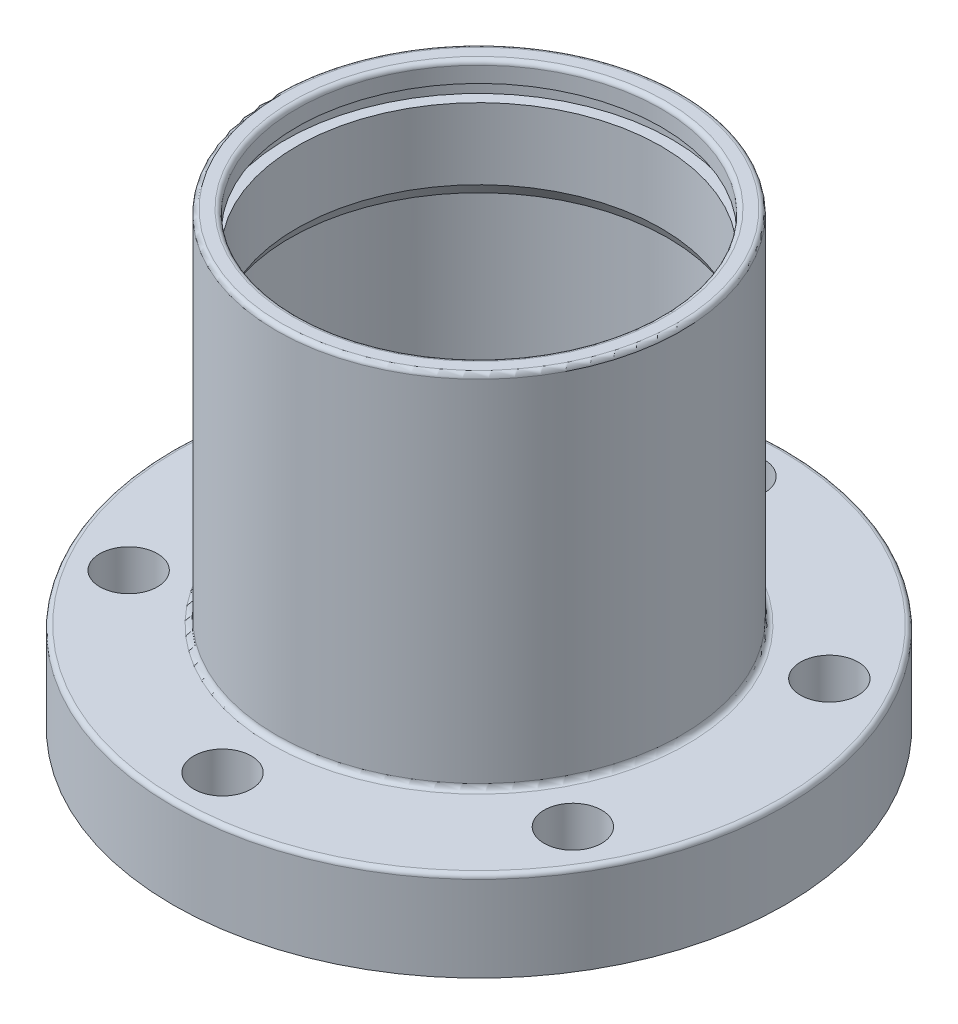
ISO-10303-21;
HEADER;
FILE_DESCRIPTION(('STEP AP214'),'2;1');
FILE_NAME('part.step','',(''),(''),'','','');
FILE_SCHEMA(('AUTOMOTIVE_DESIGN { 1 0 10303 214 1 1 1 1 }'));
ENDSEC;
DATA;
#1=APPLICATION_CONTEXT('core data for automotive mechanical design processes');
#2=APPLICATION_PROTOCOL_DEFINITION('international standard','automotive_design',2000,#1);
#3=PRODUCT_CONTEXT('',#1,'mechanical');
#4=PRODUCT('Part','Part','',(#3));
#5=PRODUCT_RELATED_PRODUCT_CATEGORY('part','',(#4));
#6=PRODUCT_DEFINITION_FORMATION('','',#4);
#7=PRODUCT_DEFINITION_CONTEXT('part definition',#1,'design');
#8=PRODUCT_DEFINITION('design','',#6,#7);
#9=PRODUCT_DEFINITION_SHAPE('','',#8);
#10=(LENGTH_UNIT() NAMED_UNIT(*) SI_UNIT(.MILLI.,.METRE.));
#11=(NAMED_UNIT(*) PLANE_ANGLE_UNIT() SI_UNIT($,.RADIAN.));
#12=(NAMED_UNIT(*) SI_UNIT($,.STERADIAN.) SOLID_ANGLE_UNIT());
#13=UNCERTAINTY_MEASURE_WITH_UNIT(LENGTH_MEASURE(1.E-05),#10,'distance_accuracy_value','');
#14=(GEOMETRIC_REPRESENTATION_CONTEXT(3) GLOBAL_UNCERTAINTY_ASSIGNED_CONTEXT((#13)) GLOBAL_UNIT_ASSIGNED_CONTEXT((#10,
#11,#12)) REPRESENTATION_CONTEXT('',''));
#15=CARTESIAN_POINT('',(0.,0.,0.));
#16=DIRECTION('',(0.,0.,1.));
#17=DIRECTION('',(1.,0.,0.));
#18=AXIS2_PLACEMENT_3D('',#15,#16,#17);
#19=CARTESIAN_POINT('',(17.,4.,0.));
#20=DIRECTION('',(0.,1.,0.));
#21=DIRECTION('',(0.,0.,1.));
#22=AXIS2_PLACEMENT_3D('',#19,#20,#21);
#23=CYLINDRICAL_SURFACE('',#22,2.075);
#24=CARTESIAN_POINT('',(17.,4.,0.));
#25=DIRECTION('',(0.,1.,0.));
#26=DIRECTION('',(0.,0.,1.));
#27=AXIS2_PLACEMENT_3D('',#24,#25,#26);
#28=CIRCLE('',#27,2.075);
#29=CARTESIAN_POINT('',(17.,4.,2.075));
#30=VERTEX_POINT('',#29);
#31=EDGE_CURVE('E252',#30,#30,#28,.T.);
#32=ORIENTED_EDGE('',*,*,#31,.F.);
#33=EDGE_LOOP('',(#32));
#34=FACE_BOUND('',#33,.T.);
#35=CARTESIAN_POINT('',(17.,9.,0.));
#36=DIRECTION('',(0.,1.,0.));
#37=DIRECTION('',(0.,0.,1.));
#38=AXIS2_PLACEMENT_3D('',#35,#36,#37);
#39=CIRCLE('',#38,2.075);
#40=CARTESIAN_POINT('',(17.,9.,2.075));
#41=VERTEX_POINT('',#40);
#42=EDGE_CURVE('E289',#41,#41,#39,.T.);
#43=ORIENTED_EDGE('',*,*,#42,.T.);
#44=EDGE_LOOP('',(#43));
#45=FACE_BOUND('',#44,.T.);
#46=ADVANCED_FACE('F16',(#34,#45),#23,.F.);
#47=CARTESIAN_POINT('',(-17.,4.,0.));
#48=DIRECTION('',(0.,1.,0.));
#49=DIRECTION('',(0.,0.,1.));
#50=AXIS2_PLACEMENT_3D('',#47,#48,#49);
#51=CYLINDRICAL_SURFACE('',#50,2.075);
#52=CARTESIAN_POINT('',(-17.,4.,0.));
#53=DIRECTION('',(0.,1.,0.));
#54=DIRECTION('',(0.,0.,1.));
#55=AXIS2_PLACEMENT_3D('',#52,#53,#54);
#56=CIRCLE('',#55,2.075);
#57=CARTESIAN_POINT('',(-17.,4.,2.075));
#58=VERTEX_POINT('',#57);
#59=EDGE_CURVE('E247',#58,#58,#56,.T.);
#60=ORIENTED_EDGE('',*,*,#59,.F.);
#61=EDGE_LOOP('',(#60));
#62=FACE_BOUND('',#61,.T.);
#63=CARTESIAN_POINT('',(-17.,9.,0.));
#64=DIRECTION('',(0.,1.,0.));
#65=DIRECTION('',(0.,0.,1.));
#66=AXIS2_PLACEMENT_3D('',#63,#64,#65);
#67=CIRCLE('',#66,2.075);
#68=CARTESIAN_POINT('',(-17.,9.,2.075));
#69=VERTEX_POINT('',#68);
#70=EDGE_CURVE('E284',#69,#69,#67,.T.);
#71=ORIENTED_EDGE('',*,*,#70,.T.);
#72=EDGE_LOOP('',(#71));
#73=FACE_BOUND('',#72,.T.);
#74=ADVANCED_FACE('F320',(#62,#73),#51,.F.);
#75=CARTESIAN_POINT('',(-24.6817240078565,7.5,14.25));
#76=DIRECTION('',(0.,1.,0.));
#77=DIRECTION('',(-0.866025403784439,0.,0.5));
#78=AXIS2_PLACEMENT_3D('',#75,#76,#77);
#79=CYLINDRICAL_SURFACE('',#78,3.2);
#80=CARTESIAN_POINT('',(-24.6817240078565,7.5,14.25));
#81=DIRECTION('',(0.,1.,0.));
#82=DIRECTION('',(-0.866025403784439,0.,0.5));
#83=AXIS2_PLACEMENT_3D('',#80,#81,#82);
#84=CIRCLE('',#83,3.2);
#85=CARTESIAN_POINT('',(-27.4530052999667,7.5,15.85));
#86=VERTEX_POINT('',#85);
#87=EDGE_CURVE('E229',#86,#86,#84,.T.);
#88=ORIENTED_EDGE('',*,*,#87,.F.);
#89=EDGE_LOOP('',(#88));
#90=FACE_BOUND('',#89,.T.);
#91=CARTESIAN_POINT('',(-24.6817240078565,17.5,14.25));
#92=DIRECTION('',(0.,1.,0.));
#93=DIRECTION('',(0.,0.,1.));
#94=AXIS2_PLACEMENT_3D('',#91,#92,#93);
#95=CIRCLE('',#94,3.2);
#96=CARTESIAN_POINT('',(-24.6817240078565,17.5,17.45));
#97=VERTEX_POINT('',#96);
#98=EDGE_CURVE('E207',#97,#97,#95,.T.);
#99=ORIENTED_EDGE('',*,*,#98,.T.);
#100=EDGE_LOOP('',(#99));
#101=FACE_BOUND('',#100,.T.);
#102=ADVANCED_FACE('F326',(#90,#101),#79,.F.);
#103=CARTESIAN_POINT('',(-24.6817240078565,7.5,-14.25));
#104=DIRECTION('',(0.,1.,0.));
#105=DIRECTION('',(-0.866025403784439,0.,-0.5));
#106=AXIS2_PLACEMENT_3D('',#103,#104,#105);
#107=CYLINDRICAL_SURFACE('',#106,3.2);
#108=CARTESIAN_POINT('',(-24.6817240078565,7.5,-14.25));
#109=DIRECTION('',(0.,1.,0.));
#110=DIRECTION('',(-0.866025403784439,0.,-0.5));
#111=AXIS2_PLACEMENT_3D('',#108,#109,#110);
#112=CIRCLE('',#111,3.2);
#113=CARTESIAN_POINT('',(-27.4530052999667,7.5,-15.85));
#114=VERTEX_POINT('',#113);
#115=EDGE_CURVE('E226',#114,#114,#112,.T.);
#116=ORIENTED_EDGE('',*,*,#115,.F.);
#117=EDGE_LOOP('',(#116));
#118=FACE_BOUND('',#117,.T.);
#119=CARTESIAN_POINT('',(-24.6817240078565,17.5,-14.25));
#120=DIRECTION('',(0.,1.,0.));
#121=DIRECTION('',(0.,0.,1.));
#122=AXIS2_PLACEMENT_3D('',#119,#120,#121);
#123=CIRCLE('',#122,3.2);
#124=CARTESIAN_POINT('',(-24.6817240078565,17.5,-11.05));
#125=VERTEX_POINT('',#124);
#126=EDGE_CURVE('E204',#125,#125,#123,.T.);
#127=ORIENTED_EDGE('',*,*,#126,.T.);
#128=EDGE_LOOP('',(#127));
#129=FACE_BOUND('',#128,.T.);
#130=ADVANCED_FACE('F440',(#118,#129),#107,.F.);
#131=CARTESIAN_POINT('',(0.,7.5,-28.5));
#132=DIRECTION('',(0.,1.,0.));
#133=DIRECTION('',(0.,0.,-1.));
#134=AXIS2_PLACEMENT_3D('',#131,#132,#133);
#135=CYLINDRICAL_SURFACE('',#134,3.2);
#136=CARTESIAN_POINT('',(0.,7.5,-28.5));
#137=DIRECTION('',(0.,1.,0.));
#138=DIRECTION('',(0.,0.,-1.));
#139=AXIS2_PLACEMENT_3D('',#136,#137,#138);
#140=CIRCLE('',#139,3.2);
#141=CARTESIAN_POINT('',(0.,7.5,-31.7));
#142=VERTEX_POINT('',#141);
#143=EDGE_CURVE('E223',#142,#142,#140,.T.);
#144=ORIENTED_EDGE('',*,*,#143,.F.);
#145=EDGE_LOOP('',(#144));
#146=FACE_BOUND('',#145,.T.);
#147=CARTESIAN_POINT('',(0.,17.5,-28.5));
#148=DIRECTION('',(0.,1.,0.));
#149=DIRECTION('',(0.,0.,1.));
#150=AXIS2_PLACEMENT_3D('',#147,#148,#149);
#151=CIRCLE('',#150,3.2);
#152=CARTESIAN_POINT('',(0.,17.5,-25.3));
#153=VERTEX_POINT('',#152);
#154=EDGE_CURVE('E201',#153,#153,#151,.T.);
#155=ORIENTED_EDGE('',*,*,#154,.T.);
#156=EDGE_LOOP('',(#155));
#157=FACE_BOUND('',#156,.T.);
#158=ADVANCED_FACE('F436',(#146,#157),#135,.F.);
#159=CARTESIAN_POINT('',(24.6817240078565,7.5,-14.25));
#160=DIRECTION('',(0.,1.,0.));
#161=DIRECTION('',(0.866025403784439,0.,-0.5));
#162=AXIS2_PLACEMENT_3D('',#159,#160,#161);
#163=CYLINDRICAL_SURFACE('',#162,3.2);
#164=CARTESIAN_POINT('',(24.6817240078565,7.5,-14.25));
#165=DIRECTION('',(0.,1.,0.));
#166=DIRECTION('',(0.866025403784439,0.,-0.5));
#167=AXIS2_PLACEMENT_3D('',#164,#165,#166);
#168=CIRCLE('',#167,3.2);
#169=CARTESIAN_POINT('',(27.4530052999667,7.5,-15.85));
#170=VERTEX_POINT('',#169);
#171=EDGE_CURVE('E220',#170,#170,#168,.T.);
#172=ORIENTED_EDGE('',*,*,#171,.F.);
#173=EDGE_LOOP('',(#172));
#174=FACE_BOUND('',#173,.T.);
#175=CARTESIAN_POINT('',(24.6817240078565,17.5,-14.25));
#176=DIRECTION('',(0.,1.,0.));
#177=DIRECTION('',(0.,0.,1.));
#178=AXIS2_PLACEMENT_3D('',#175,#176,#177);
#179=CIRCLE('',#178,3.2);
#180=CARTESIAN_POINT('',(24.6817240078565,17.5,-11.05));
#181=VERTEX_POINT('',#180);
#182=EDGE_CURVE('E198',#181,#181,#179,.T.);
#183=ORIENTED_EDGE('',*,*,#182,.T.);
#184=EDGE_LOOP('',(#183));
#185=FACE_BOUND('',#184,.T.);
#186=ADVANCED_FACE('F432',(#174,#185),#163,.F.);
#187=CARTESIAN_POINT('',(24.6817240078565,7.5,14.25));
#188=DIRECTION('',(0.,1.,0.));
#189=DIRECTION('',(0.866025403784439,0.,0.5));
#190=AXIS2_PLACEMENT_3D('',#187,#188,#189);
#191=CYLINDRICAL_SURFACE('',#190,3.2);
#192=CARTESIAN_POINT('',(24.6817240078565,7.5,14.25));
#193=DIRECTION('',(0.,1.,0.));
#194=DIRECTION('',(0.866025403784439,0.,0.5));
#195=AXIS2_PLACEMENT_3D('',#192,#193,#194);
#196=CIRCLE('',#195,3.2);
#197=CARTESIAN_POINT('',(27.4530052999667,7.5,15.85));
#198=VERTEX_POINT('',#197);
#199=EDGE_CURVE('E217',#198,#198,#196,.T.);
#200=ORIENTED_EDGE('',*,*,#199,.F.);
#201=EDGE_LOOP('',(#200));
#202=FACE_BOUND('',#201,.T.);
#203=CARTESIAN_POINT('',(24.6817240078565,17.5,14.25));
#204=DIRECTION('',(0.,1.,0.));
#205=DIRECTION('',(0.,0.,1.));
#206=AXIS2_PLACEMENT_3D('',#203,#204,#205);
#207=CIRCLE('',#206,3.2);
#208=CARTESIAN_POINT('',(24.6817240078565,17.5,17.45));
#209=VERTEX_POINT('',#208);
#210=EDGE_CURVE('E195',#209,#209,#207,.T.);
#211=ORIENTED_EDGE('',*,*,#210,.T.);
#212=EDGE_LOOP('',(#211));
#213=FACE_BOUND('',#212,.T.);
#214=ADVANCED_FACE('F428',(#202,#213),#191,.F.);
#215=CARTESIAN_POINT('',(0.,7.5,28.5));
#216=DIRECTION('',(0.,1.,0.));
#217=DIRECTION('',(0.,0.,1.));
#218=AXIS2_PLACEMENT_3D('',#215,#216,#217);
#219=CYLINDRICAL_SURFACE('',#218,3.2);
#220=CARTESIAN_POINT('',(0.,7.5,28.5));
#221=DIRECTION('',(0.,1.,0.));
#222=DIRECTION('',(0.,0.,1.));
#223=AXIS2_PLACEMENT_3D('',#220,#221,#222);
#224=CIRCLE('',#223,3.2);
#225=CARTESIAN_POINT('',(0.,7.5,31.7));
#226=VERTEX_POINT('',#225);
#227=EDGE_CURVE('E214',#226,#226,#224,.T.);
#228=ORIENTED_EDGE('',*,*,#227,.F.);
#229=EDGE_LOOP('',(#228));
#230=FACE_BOUND('',#229,.T.);
#231=CARTESIAN_POINT('',(0.,17.5,28.5));
#232=DIRECTION('',(0.,1.,0.));
#233=DIRECTION('',(0.,0.,1.));
#234=AXIS2_PLACEMENT_3D('',#231,#232,#233);
#235=CIRCLE('',#234,3.2);
#236=CARTESIAN_POINT('',(0.,17.5,31.7));
#237=VERTEX_POINT('',#236);
#238=EDGE_CURVE('E191',#237,#237,#235,.T.);
#239=ORIENTED_EDGE('',*,*,#238,.T.);
#240=EDGE_LOOP('',(#239));
#241=FACE_BOUND('',#240,.T.);
#242=ADVANCED_FACE('F424',(#230,#241),#219,.F.);
#243=CARTESIAN_POINT('',(0.,57.,0.));
#244=DIRECTION('',(0.,1.,0.));
#245=DIRECTION('',(0.,0.,1.));
#246=AXIS2_PLACEMENT_3D('',#243,#244,#245);
#247=TOROIDAL_SURFACE('',#246,20.75,0.5);
#248=CARTESIAN_POINT('',(0.,57.5,0.));
#249=DIRECTION('',(0.,-1.,0.));
#250=DIRECTION('',(0.,0.,1.));
#251=AXIS2_PLACEMENT_3D('',#248,#249,#250);
#252=CIRCLE('',#251,20.75);
#253=CARTESIAN_POINT('',(0.,57.5,20.75));
#254=VERTEX_POINT('',#253);
#255=EDGE_CURVE('E180',#254,#254,#252,.T.);
#256=ORIENTED_EDGE('',*,*,#255,.F.);
#257=EDGE_LOOP('',(#256));
#258=FACE_BOUND('',#257,.T.);
#259=CARTESIAN_POINT('',(0.,57.,0.));
#260=DIRECTION('',(0.,1.,0.));
#261=DIRECTION('',(0.,0.,1.));
#262=AXIS2_PLACEMENT_3D('',#259,#260,#261);
#263=CIRCLE('',#262,20.25);
#264=CARTESIAN_POINT('',(0.,57.,20.25));
#265=VERTEX_POINT('',#264);
#266=EDGE_CURVE('E177',#265,#265,#263,.T.);
#267=ORIENTED_EDGE('',*,*,#266,.F.);
#268=EDGE_LOOP('',(#267));
#269=FACE_BOUND('',#268,.T.);
#270=ADVANCED_FACE('F420',(#258,#269),#247,.T.);
#271=CARTESIAN_POINT('',(0.,57.,0.));
#272=DIRECTION('',(0.,1.,0.));
#273=DIRECTION('',(0.,0.,1.));
#274=AXIS2_PLACEMENT_3D('',#271,#272,#273);
#275=TOROIDAL_SURFACE('',#274,22.,0.5);
#276=CARTESIAN_POINT('',(0.,57.,0.));
#277=DIRECTION('',(0.,-1.,0.));
#278=DIRECTION('',(0.,0.,1.));
#279=AXIS2_PLACEMENT_3D('',#276,#277,#278);
#280=CIRCLE('',#279,22.5);
#281=CARTESIAN_POINT('',(0.,57.,22.5));
#282=VERTEX_POINT('',#281);
#283=EDGE_CURVE('E187',#282,#282,#280,.T.);
#284=ORIENTED_EDGE('',*,*,#283,.F.);
#285=EDGE_LOOP('',(#284));
#286=FACE_BOUND('',#285,.T.);
#287=CARTESIAN_POINT('',(0.,57.5,0.));
#288=DIRECTION('',(0.,1.,0.));
#289=DIRECTION('',(0.,0.,1.));
#290=AXIS2_PLACEMENT_3D('',#287,#288,#289);
#291=CIRCLE('',#290,22.);
#292=CARTESIAN_POINT('',(0.,57.5,22.));
#293=VERTEX_POINT('',#292);
#294=EDGE_CURVE('E181',#293,#293,#291,.T.);
#295=ORIENTED_EDGE('',*,*,#294,.F.);
#296=EDGE_LOOP('',(#295));
#297=FACE_BOUND('',#296,.T.);
#298=ADVANCED_FACE('F416',(#286,#297),#275,.T.);
#299=CARTESIAN_POINT('',(0.,17.,0.));
#300=DIRECTION('',(0.,1.,0.));
#301=DIRECTION('',(0.,0.,1.));
#302=AXIS2_PLACEMENT_3D('',#299,#300,#301);
#303=TOROIDAL_SURFACE('',#302,33.5,0.5);
#304=CARTESIAN_POINT('',(0.,17.,0.));
#305=DIRECTION('',(0.,-1.,0.));
#306=DIRECTION('',(0.,0.,1.));
#307=AXIS2_PLACEMENT_3D('',#304,#305,#306);
#308=CIRCLE('',#307,34.);
#309=CARTESIAN_POINT('',(0.,17.,34.));
#310=VERTEX_POINT('',#309);
#311=EDGE_CURVE('E208',#310,#310,#308,.T.);
#312=ORIENTED_EDGE('',*,*,#311,.F.);
#313=EDGE_LOOP('',(#312));
#314=FACE_BOUND('',#313,.T.);
#315=CARTESIAN_POINT('',(0.,17.5,0.));
#316=DIRECTION('',(0.,1.,0.));
#317=DIRECTION('',(0.,0.,1.));
#318=AXIS2_PLACEMENT_3D('',#315,#316,#317);
#319=CIRCLE('',#318,33.5);
#320=CARTESIAN_POINT('',(0.,17.5,33.5));
#321=VERTEX_POINT('',#320);
#322=EDGE_CURVE('E194',#321,#321,#319,.T.);
#323=ORIENTED_EDGE('',*,*,#322,.F.);
#324=EDGE_LOOP('',(#323));
#325=FACE_BOUND('',#324,.T.);
#326=ADVANCED_FACE('F412',(#314,#325),#303,.T.);
#327=CARTESIAN_POINT('',(0.,18.1,0.));
#328=DIRECTION('',(0.,1.,0.));
#329=DIRECTION('',(0.,0.,1.));
#330=AXIS2_PLACEMENT_3D('',#327,#328,#329);
#331=TOROIDAL_SURFACE('',#330,23.1,0.6);
#332=CARTESIAN_POINT('',(0.,17.5,0.));
#333=DIRECTION('',(0.,-1.,0.));
#334=DIRECTION('',(0.,0.,1.));
#335=AXIS2_PLACEMENT_3D('',#332,#333,#334);
#336=CIRCLE('',#335,23.1);
#337=CARTESIAN_POINT('',(0.,17.5,23.1));
#338=VERTEX_POINT('',#337);
#339=EDGE_CURVE('E190',#338,#338,#336,.T.);
#340=ORIENTED_EDGE('',*,*,#339,.F.);
#341=EDGE_LOOP('',(#340));
#342=FACE_BOUND('',#341,.T.);
#343=CARTESIAN_POINT('',(0.,18.1,0.));
#344=DIRECTION('',(0.,1.,0.));
#345=DIRECTION('',(0.,0.,1.));
#346=AXIS2_PLACEMENT_3D('',#343,#344,#345);
#347=CIRCLE('',#346,22.5);
#348=CARTESIAN_POINT('',(0.,18.1,22.5));
#349=VERTEX_POINT('',#348);
#350=EDGE_CURVE('E184',#349,#349,#347,.T.);
#351=ORIENTED_EDGE('',*,*,#350,.F.);
#352=EDGE_LOOP('',(#351));
#353=FACE_BOUND('',#352,.T.);
#354=ADVANCED_FACE('F385',(#342,#353),#331,.F.);
#355=CARTESIAN_POINT('',(0.,9.6,0.));
#356=DIRECTION('',(0.,1.,0.));
#357=DIRECTION('',(0.,0.,1.));
#358=AXIS2_PLACEMENT_3D('',#355,#356,#357);
#359=TOROIDAL_SURFACE('',#358,20.4,0.6);
#360=CARTESIAN_POINT('',(0.,9.6,0.));
#361=DIRECTION('',(0.,-1.,0.));
#362=DIRECTION('',(0.,0.,1.));
#363=AXIS2_PLACEMENT_3D('',#360,#361,#362);
#364=CIRCLE('',#363,21.);
#365=CARTESIAN_POINT('',(0.,9.6,21.));
#366=VERTEX_POINT('',#365);
#367=EDGE_CURVE('E11',#366,#366,#364,.T.);
#368=ORIENTED_EDGE('',*,*,#367,.F.);
#369=EDGE_LOOP('',(#368));
#370=FACE_BOUND('',#369,.T.);
#371=CARTESIAN_POINT('',(0.,9.,0.));
#372=DIRECTION('',(0.,1.,0.));
#373=DIRECTION('',(0.,0.,1.));
#374=AXIS2_PLACEMENT_3D('',#371,#372,#373);
#375=CIRCLE('',#374,20.4);
#376=CARTESIAN_POINT('',(0.,9.,20.4));
#377=VERTEX_POINT('',#376);
#378=EDGE_CURVE('E276',#377,#377,#375,.T.);
#379=ORIENTED_EDGE('',*,*,#378,.F.);
#380=EDGE_LOOP('',(#379));
#381=FACE_BOUND('',#380,.T.);
#382=ADVANCED_FACE('F381',(#370,#381),#359,.F.);
#383=CARTESIAN_POINT('',(0.,0.,0.));
#384=DIRECTION('',(0.,-1.,0.));
#385=DIRECTION('',(0.,0.,-1.));
#386=AXIS2_PLACEMENT_3D('',#383,#384,#385);
#387=CYLINDRICAL_SURFACE('',#386,21.);
#388=CARTESIAN_POINT('',(0.,44.2009618943233,0.));
#389=DIRECTION('',(0.,-1.,0.));
#390=DIRECTION('',(0.,0.,-1.));
#391=AXIS2_PLACEMENT_3D('',#388,#389,#390);
#392=CIRCLE('',#391,21.);
#393=CARTESIAN_POINT('',(0.,44.2009618943233,-21.));
#394=VERTEX_POINT('',#393);
#395=EDGE_CURVE('E25',#394,#394,#392,.T.);
#396=ORIENTED_EDGE('',*,*,#395,.F.);
#397=EDGE_LOOP('',(#396));
#398=FACE_BOUND('',#397,.T.);
#399=ORIENTED_EDGE('',*,*,#367,.T.);
#400=EDGE_LOOP('',(#399));
#401=FACE_BOUND('',#400,.T.);
#402=ADVANCED_FACE('F384',(#398,#401),#387,.F.);
#403=CARTESIAN_POINT('',(0.,45.5,0.));
#404=DIRECTION('',(0.,-1.,0.));
#405=DIRECTION('',(0.,0.,-1.));
#406=AXIS2_PLACEMENT_3D('',#403,#404,#405);
#407=CONICAL_SURFACE('',#406,20.25,0.523598775);
#408=CARTESIAN_POINT('',(0.,45.5,0.));
#409=DIRECTION('',(0.,-1.,0.));
#410=DIRECTION('',(0.,0.,-1.));
#411=AXIS2_PLACEMENT_3D('',#408,#409,#410);
#412=CIRCLE('',#411,20.25);
#413=CARTESIAN_POINT('',(0.,45.5,-20.25));
#414=VERTEX_POINT('',#413);
#415=EDGE_CURVE('E156',#414,#414,#412,.T.);
#416=ORIENTED_EDGE('',*,*,#415,.F.);
#417=EDGE_LOOP('',(#416));
#418=FACE_BOUND('',#417,.T.);
#419=ORIENTED_EDGE('',*,*,#395,.T.);
#420=EDGE_LOOP('',(#419));
#421=FACE_BOUND('',#420,.T.);
#422=ADVANCED_FACE('F403',(#418,#421),#407,.F.);
#423=CARTESIAN_POINT('',(0.,0.,0.));
#424=DIRECTION('',(0.,-1.,0.));
#425=DIRECTION('',(0.,0.,-1.));
#426=AXIS2_PLACEMENT_3D('',#423,#424,#425);
#427=CYLINDRICAL_SURFACE('',#426,20.25);
#428=CARTESIAN_POINT('',(0.,53.4,0.));
#429=DIRECTION('',(0.,-1.,0.));
#430=DIRECTION('',(0.,0.,-1.));
#431=AXIS2_PLACEMENT_3D('',#428,#429,#430);
#432=CIRCLE('',#431,20.25);
#433=CARTESIAN_POINT('',(0.,53.4,-20.25));
#434=VERTEX_POINT('',#433);
#435=EDGE_CURVE('E160',#434,#434,#432,.T.);
#436=ORIENTED_EDGE('',*,*,#435,.F.);
#437=EDGE_LOOP('',(#436));
#438=FACE_BOUND('',#437,.T.);
#439=ORIENTED_EDGE('',*,*,#415,.T.);
#440=EDGE_LOOP('',(#439));
#441=FACE_BOUND('',#440,.T.);
#442=ADVANCED_FACE('F157',(#438,#441),#427,.F.);
#443=CARTESIAN_POINT('',(0.,53.4,21.5));
#444=DIRECTION('',(0.,1.,0.));
#445=DIRECTION('',(1.,0.,0.));
#446=AXIS2_PLACEMENT_3D('',#443,#444,#445);
#447=PLANE('',#446);
#448=CARTESIAN_POINT('',(0.,53.4,0.));
#449=DIRECTION('',(0.,-1.,0.));
#450=DIRECTION('',(0.,0.,-1.));
#451=AXIS2_PLACEMENT_3D('',#448,#449,#450);
#452=CIRCLE('',#451,21.5);
#453=CARTESIAN_POINT('',(0.,53.4,-21.5));
#454=VERTEX_POINT('',#453);
#455=EDGE_CURVE('E166',#454,#454,#452,.T.);
#456=ORIENTED_EDGE('',*,*,#455,.F.);
#457=EDGE_LOOP('',(#456));
#458=FACE_BOUND('',#457,.T.);
#459=ORIENTED_EDGE('',*,*,#435,.T.);
#460=EDGE_LOOP('',(#459));
#461=FACE_BOUND('',#460,.T.);
#462=ADVANCED_FACE('F396',(#458,#461),#447,.T.);
#463=CARTESIAN_POINT('',(0.,0.,0.));
#464=DIRECTION('',(0.,-1.,0.));
#465=DIRECTION('',(0.,0.,-1.));
#466=AXIS2_PLACEMENT_3D('',#463,#464,#465);
#467=CYLINDRICAL_SURFACE('',#466,21.5);
#468=CARTESIAN_POINT('',(0.,55.25,0.));
#469=DIRECTION('',(0.,-1.,0.));
#470=DIRECTION('',(0.,0.,-1.));
#471=AXIS2_PLACEMENT_3D('',#468,#469,#470);
#472=CIRCLE('',#471,21.5);
#473=CARTESIAN_POINT('',(0.,55.25,-21.5));
#474=VERTEX_POINT('',#473);
#475=EDGE_CURVE('E171',#474,#474,#472,.T.);
#476=ORIENTED_EDGE('',*,*,#475,.F.);
#477=EDGE_LOOP('',(#476));
#478=FACE_BOUND('',#477,.T.);
#479=ORIENTED_EDGE('',*,*,#455,.T.);
#480=EDGE_LOOP('',(#479));
#481=FACE_BOUND('',#480,.T.);
#482=ADVANCED_FACE('F392',(#478,#481),#467,.F.);
#483=CARTESIAN_POINT('',(0.,55.25,20.25));
#484=DIRECTION('',(0.,-1.,0.));
#485=DIRECTION('',(0.,0.,-1.));
#486=AXIS2_PLACEMENT_3D('',#483,#484,#485);
#487=PLANE('',#486);
#488=CARTESIAN_POINT('',(0.,55.25,0.));
#489=DIRECTION('',(0.,-1.,0.));
#490=DIRECTION('',(0.,0.,-1.));
#491=AXIS2_PLACEMENT_3D('',#488,#489,#490);
#492=CIRCLE('',#491,20.25);
#493=CARTESIAN_POINT('',(0.,55.25,-20.25));
#494=VERTEX_POINT('',#493);
#495=EDGE_CURVE('E174',#494,#494,#492,.T.);
#496=ORIENTED_EDGE('',*,*,#495,.F.);
#497=EDGE_LOOP('',(#496));
#498=FACE_BOUND('',#497,.T.);
#499=ORIENTED_EDGE('',*,*,#475,.T.);
#500=EDGE_LOOP('',(#499));
#501=FACE_BOUND('',#500,.T.);
#502=ADVANCED_FACE('F357',(#498,#501),#487,.T.);
#503=CARTESIAN_POINT('',(0.,0.,0.));
#504=DIRECTION('',(0.,-1.,0.));
#505=DIRECTION('',(0.,0.,-1.));
#506=AXIS2_PLACEMENT_3D('',#503,#504,#505);
#507=CYLINDRICAL_SURFACE('',#506,20.25);
#508=ORIENTED_EDGE('',*,*,#495,.T.);
#509=EDGE_LOOP('',(#508));
#510=FACE_BOUND('',#509,.T.);
#511=ORIENTED_EDGE('',*,*,#266,.T.);
#512=EDGE_LOOP('',(#511));
#513=FACE_BOUND('',#512,.T.);
#514=ADVANCED_FACE('F354',(#510,#513),#507,.F.);
#515=CARTESIAN_POINT('',(0.,57.5,22.5));
#516=DIRECTION('',(0.,1.,0.));
#517=DIRECTION('',(1.,0.,0.));
#518=AXIS2_PLACEMENT_3D('',#515,#516,#517);
#519=PLANE('',#518);
#520=ORIENTED_EDGE('',*,*,#255,.T.);
#521=EDGE_LOOP('',(#520));
#522=FACE_BOUND('',#521,.T.);
#523=ORIENTED_EDGE('',*,*,#294,.T.);
#524=EDGE_LOOP('',(#523));
#525=FACE_BOUND('',#524,.T.);
#526=ADVANCED_FACE('F356',(#522,#525),#519,.T.);
#527=CARTESIAN_POINT('',(0.,0.,0.));
#528=DIRECTION('',(0.,-1.,0.));
#529=DIRECTION('',(0.,0.,-1.));
#530=AXIS2_PLACEMENT_3D('',#527,#528,#529);
#531=CYLINDRICAL_SURFACE('',#530,22.5);
#532=ORIENTED_EDGE('',*,*,#350,.T.);
#533=EDGE_LOOP('',(#532));
#534=FACE_BOUND('',#533,.T.);
#535=ORIENTED_EDGE('',*,*,#283,.T.);
#536=EDGE_LOOP('',(#535));
#537=FACE_BOUND('',#536,.T.);
#538=ADVANCED_FACE('F379',(#534,#537),#531,.T.);
#539=CARTESIAN_POINT('',(0.,17.5,34.));
#540=DIRECTION('',(0.,1.,0.));
#541=DIRECTION('',(1.,0.,0.));
#542=AXIS2_PLACEMENT_3D('',#539,#540,#541);
#543=PLANE('',#542);
#544=ORIENTED_EDGE('',*,*,#339,.T.);
#545=EDGE_LOOP('',(#544));
#546=FACE_BOUND('',#545,.T.);
#547=ORIENTED_EDGE('',*,*,#322,.T.);
#548=EDGE_LOOP('',(#547));
#549=FACE_BOUND('',#548,.T.);
#550=ORIENTED_EDGE('',*,*,#238,.F.);
#551=EDGE_LOOP('',(#550));
#552=FACE_BOUND('',#551,.T.);
#553=ORIENTED_EDGE('',*,*,#210,.F.);
#554=EDGE_LOOP('',(#553));
#555=FACE_BOUND('',#554,.T.);
#556=ORIENTED_EDGE('',*,*,#182,.F.);
#557=EDGE_LOOP('',(#556));
#558=FACE_BOUND('',#557,.T.);
#559=ORIENTED_EDGE('',*,*,#154,.F.);
#560=EDGE_LOOP('',(#559));
#561=FACE_BOUND('',#560,.T.);
#562=ORIENTED_EDGE('',*,*,#126,.F.);
#563=EDGE_LOOP('',(#562));
#564=FACE_BOUND('',#563,.T.);
#565=ORIENTED_EDGE('',*,*,#98,.F.);
#566=EDGE_LOOP('',(#565));
#567=FACE_BOUND('',#566,.T.);
#568=ADVANCED_FACE('F375',(#546,#549,#552,#555,#558,#561,#564,#567),#543,.T.);
#569=CARTESIAN_POINT('',(0.,0.,0.));
#570=DIRECTION('',(0.,-1.,0.));
#571=DIRECTION('',(0.,0.,-1.));
#572=AXIS2_PLACEMENT_3D('',#569,#570,#571);
#573=CYLINDRICAL_SURFACE('',#572,34.);
#574=CARTESIAN_POINT('',(0.,7.5,0.));
#575=DIRECTION('',(0.,-1.,0.));
#576=DIRECTION('',(0.,0.,-1.));
#577=AXIS2_PLACEMENT_3D('',#574,#575,#576);
#578=CIRCLE('',#577,34.);
#579=CARTESIAN_POINT('',(0.,7.5,-34.));
#580=VERTEX_POINT('',#579);
#581=EDGE_CURVE('E211',#580,#580,#578,.T.);
#582=ORIENTED_EDGE('',*,*,#581,.F.);
#583=EDGE_LOOP('',(#582));
#584=FACE_BOUND('',#583,.T.);
#585=ORIENTED_EDGE('',*,*,#311,.T.);
#586=EDGE_LOOP('',(#585));
#587=FACE_BOUND('',#586,.T.);
#588=ADVANCED_FACE('F371',(#584,#587),#573,.T.);
#589=CARTESIAN_POINT('',(0.,7.5,23.9));
#590=DIRECTION('',(0.,-1.,0.));
#591=DIRECTION('',(0.,0.,-1.));
#592=AXIS2_PLACEMENT_3D('',#589,#590,#591);
#593=PLANE('',#592);
#594=CARTESIAN_POINT('',(0.,7.5,0.));
#595=DIRECTION('',(0.,-1.,0.));
#596=DIRECTION('',(0.,0.,-1.));
#597=AXIS2_PLACEMENT_3D('',#594,#595,#596);
#598=CIRCLE('',#597,23.9);
#599=CARTESIAN_POINT('',(0.,7.5,-23.9));
#600=VERTEX_POINT('',#599);
#601=EDGE_CURVE('E233',#600,#600,#598,.T.);
#602=ORIENTED_EDGE('',*,*,#601,.F.);
#603=EDGE_LOOP('',(#602));
#604=FACE_BOUND('',#603,.T.);
#605=ORIENTED_EDGE('',*,*,#581,.T.);
#606=EDGE_LOOP('',(#605));
#607=FACE_BOUND('',#606,.T.);
#608=ORIENTED_EDGE('',*,*,#227,.T.);
#609=EDGE_LOOP('',(#608));
#610=FACE_BOUND('',#609,.T.);
#611=ORIENTED_EDGE('',*,*,#199,.T.);
#612=EDGE_LOOP('',(#611));
#613=FACE_BOUND('',#612,.T.);
#614=ORIENTED_EDGE('',*,*,#171,.T.);
#615=EDGE_LOOP('',(#614));
#616=FACE_BOUND('',#615,.T.);
#617=ORIENTED_EDGE('',*,*,#143,.T.);
#618=EDGE_LOOP('',(#617));
#619=FACE_BOUND('',#618,.T.);
#620=ORIENTED_EDGE('',*,*,#115,.T.);
#621=EDGE_LOOP('',(#620));
#622=FACE_BOUND('',#621,.T.);
#623=ORIENTED_EDGE('',*,*,#87,.T.);
#624=EDGE_LOOP('',(#623));
#625=FACE_BOUND('',#624,.T.);
#626=ADVANCED_FACE('F367',(#604,#607,#610,#613,#616,#619,#622,#625),#593,.T.);
#627=CARTESIAN_POINT('',(0.,0.,0.));
#628=DIRECTION('',(0.,-1.,0.));
#629=DIRECTION('',(0.,0.,-1.));
#630=AXIS2_PLACEMENT_3D('',#627,#628,#629);
#631=CYLINDRICAL_SURFACE('',#630,23.9);
#632=CARTESIAN_POINT('',(0.,4.5,0.));
#633=DIRECTION('',(0.,-1.,0.));
#634=DIRECTION('',(0.,0.,-1.));
#635=AXIS2_PLACEMENT_3D('',#632,#633,#634);
#636=CIRCLE('',#635,23.9);
#637=CARTESIAN_POINT('',(0.,4.5,-23.9));
#638=VERTEX_POINT('',#637);
#639=EDGE_CURVE('E234',#638,#638,#636,.T.);
#640=ORIENTED_EDGE('',*,*,#639,.F.);
#641=EDGE_LOOP('',(#640));
#642=FACE_BOUND('',#641,.T.);
#643=ORIENTED_EDGE('',*,*,#601,.T.);
#644=EDGE_LOOP('',(#643));
#645=FACE_BOUND('',#644,.T.);
#646=ADVANCED_FACE('F363',(#642,#645),#631,.T.);
#647=CARTESIAN_POINT('',(0.,3.5,0.));
#648=DIRECTION('',(0.,1.,0.));
#649=DIRECTION('',(0.,0.,1.));
#650=AXIS2_PLACEMENT_3D('',#647,#648,#649);
#651=CONICAL_SURFACE('',#650,23.3226497308104,0.523598775);
#652=CARTESIAN_POINT('',(0.,3.5,0.));
#653=DIRECTION('',(0.,-1.,0.));
#654=DIRECTION('',(0.,0.,-1.));
#655=AXIS2_PLACEMENT_3D('',#652,#653,#654);
#656=CIRCLE('',#655,23.3226497308104);
#657=CARTESIAN_POINT('',(0.,3.5,-23.3226497308104));
#658=VERTEX_POINT('',#657);
#659=EDGE_CURVE('E237',#658,#658,#656,.T.);
#660=ORIENTED_EDGE('',*,*,#659,.F.);
#661=EDGE_LOOP('',(#660));
#662=FACE_BOUND('',#661,.T.);
#663=ORIENTED_EDGE('',*,*,#639,.T.);
#664=EDGE_LOOP('',(#663));
#665=FACE_BOUND('',#664,.T.);
#666=ADVANCED_FACE('F360',(#662,#665),#651,.T.);
#667=CARTESIAN_POINT('',(0.,3.5,21.3660254037844));
#668=DIRECTION('',(0.,-1.,0.));
#669=DIRECTION('',(0.,0.,-1.));
#670=AXIS2_PLACEMENT_3D('',#667,#668,#669);
#671=PLANE('',#670);
#672=CARTESIAN_POINT('',(0.,3.5,0.));
#673=DIRECTION('',(0.,-1.,0.));
#674=DIRECTION('',(0.,0.,-1.));
#675=AXIS2_PLACEMENT_3D('',#672,#673,#674);
#676=CIRCLE('',#675,21.3660254037844);
#677=CARTESIAN_POINT('',(0.,3.5,-21.3660254037844));
#678=VERTEX_POINT('',#677);
#679=EDGE_CURVE('E241',#678,#678,#676,.T.);
#680=ORIENTED_EDGE('',*,*,#679,.F.);
#681=EDGE_LOOP('',(#680));
#682=FACE_BOUND('',#681,.T.);
#683=ORIENTED_EDGE('',*,*,#659,.T.);
#684=EDGE_LOOP('',(#683));
#685=FACE_BOUND('',#684,.T.);
#686=ADVANCED_FACE('F347',(#682,#685),#671,.T.);
#687=CARTESIAN_POINT('',(0.,4.,0.));
#688=DIRECTION('',(0.,-1.,0.));
#689=DIRECTION('',(0.,0.,-1.));
#690=AXIS2_PLACEMENT_3D('',#687,#688,#689);
#691=CONICAL_SURFACE('',#690,20.5,1.04719755);
#692=CARTESIAN_POINT('',(0.,4.,0.));
#693=DIRECTION('',(0.,-1.,0.));
#694=DIRECTION('',(0.,0.,-1.));
#695=AXIS2_PLACEMENT_3D('',#692,#693,#694);
#696=CIRCLE('',#695,20.5);
#697=CARTESIAN_POINT('',(0.,4.,-20.5));
#698=VERTEX_POINT('',#697);
#699=EDGE_CURVE('E244',#698,#698,#696,.T.);
#700=ORIENTED_EDGE('',*,*,#699,.F.);
#701=EDGE_LOOP('',(#700));
#702=FACE_BOUND('',#701,.T.);
#703=ORIENTED_EDGE('',*,*,#679,.T.);
#704=EDGE_LOOP('',(#703));
#705=FACE_BOUND('',#704,.T.);
#706=ADVANCED_FACE('F336',(#702,#705),#691,.F.);
#707=CARTESIAN_POINT('',(0.,4.,12.));
#708=DIRECTION('',(0.,-1.,0.));
#709=DIRECTION('',(0.,0.,-1.));
#710=AXIS2_PLACEMENT_3D('',#707,#708,#709);
#711=PLANE('',#710);
#712=CARTESIAN_POINT('',(0.,4.,0.));
#713=DIRECTION('',(0.,-1.,0.));
#714=DIRECTION('',(0.,0.,-1.));
#715=AXIS2_PLACEMENT_3D('',#712,#713,#714);
#716=CIRCLE('',#715,12.);
#717=CARTESIAN_POINT('',(0.,4.,-12.));
#718=VERTEX_POINT('',#717);
#719=EDGE_CURVE('E248',#718,#718,#716,.T.);
#720=ORIENTED_EDGE('',*,*,#719,.F.);
#721=EDGE_LOOP('',(#720));
#722=FACE_BOUND('',#721,.T.);
#723=ORIENTED_EDGE('',*,*,#699,.T.);
#724=EDGE_LOOP('',(#723));
#725=FACE_BOUND('',#724,.T.);
#726=ORIENTED_EDGE('',*,*,#59,.T.);
#727=EDGE_LOOP('',(#726));
#728=FACE_BOUND('',#727,.T.);
#729=ORIENTED_EDGE('',*,*,#31,.T.);
#730=EDGE_LOOP('',(#729));
#731=FACE_BOUND('',#730,.T.);
#732=ADVANCED_FACE('F333',(#722,#725,#728,#731),#711,.T.);
#733=CARTESIAN_POINT('',(0.,0.,0.));
#734=DIRECTION('',(0.,-1.,0.));
#735=DIRECTION('',(0.,0.,-1.));
#736=AXIS2_PLACEMENT_3D('',#733,#734,#735);
#737=CYLINDRICAL_SURFACE('',#736,12.);
#738=CARTESIAN_POINT('',(0.,1.,0.));
#739=DIRECTION('',(0.,-1.,0.));
#740=DIRECTION('',(0.,0.,-1.));
#741=AXIS2_PLACEMENT_3D('',#738,#739,#740);
#742=CIRCLE('',#741,12.);
#743=CARTESIAN_POINT('',(0.,1.,-12.));
#744=VERTEX_POINT('',#743);
#745=EDGE_CURVE('E253',#744,#744,#742,.T.);
#746=ORIENTED_EDGE('',*,*,#745,.F.);
#747=EDGE_LOOP('',(#746));
#748=FACE_BOUND('',#747,.T.);
#749=ORIENTED_EDGE('',*,*,#719,.T.);
#750=EDGE_LOOP('',(#749));
#751=FACE_BOUND('',#750,.T.);
#752=ADVANCED_FACE('F335',(#748,#751),#737,.T.);
#753=CARTESIAN_POINT('',(0.,0.,0.));
#754=DIRECTION('',(0.,1.,0.));
#755=DIRECTION('',(0.,0.,1.));
#756=AXIS2_PLACEMENT_3D('',#753,#754,#755);
#757=CONICAL_SURFACE('',#756,11.4226497308104,0.523598775);
#758=CARTESIAN_POINT('',(0.,0.,0.));
#759=DIRECTION('',(0.,-1.,0.));
#760=DIRECTION('',(0.,0.,-1.));
#761=AXIS2_PLACEMENT_3D('',#758,#759,#760);
#762=CIRCLE('',#761,11.4226497308104);
#763=CARTESIAN_POINT('',(0.,0.,-11.4226497308104));
#764=VERTEX_POINT('',#763);
#765=EDGE_CURVE('E257',#764,#764,#762,.T.);
#766=ORIENTED_EDGE('',*,*,#765,.F.);
#767=EDGE_LOOP('',(#766));
#768=FACE_BOUND('',#767,.T.);
#769=ORIENTED_EDGE('',*,*,#745,.T.);
#770=EDGE_LOOP('',(#769));
#771=FACE_BOUND('',#770,.T.);
#772=ADVANCED_FACE('F344',(#768,#771),#757,.T.);
#773=CARTESIAN_POINT('',(0.,0.,10.00525));
#774=DIRECTION('',(0.,-1.,0.));
#775=DIRECTION('',(0.,0.,-1.));
#776=AXIS2_PLACEMENT_3D('',#773,#774,#775);
#777=PLANE('',#776);
#778=CARTESIAN_POINT('',(0.,0.,0.));
#779=DIRECTION('',(0.,-1.,0.));
#780=DIRECTION('',(0.,0.,-1.));
#781=AXIS2_PLACEMENT_3D('',#778,#779,#780);
#782=CIRCLE('',#781,10.00525);
#783=CARTESIAN_POINT('',(0.,0.,-10.00525));
#784=VERTEX_POINT('',#783);
#785=EDGE_CURVE('E261',#784,#784,#782,.T.);
#786=ORIENTED_EDGE('',*,*,#785,.F.);
#787=EDGE_LOOP('',(#786));
#788=FACE_BOUND('',#787,.T.);
#789=ORIENTED_EDGE('',*,*,#765,.T.);
#790=EDGE_LOOP('',(#789));
#791=FACE_BOUND('',#790,.T.);
#792=ADVANCED_FACE('F314',(#788,#791),#777,.T.);
#793=CARTESIAN_POINT('',(0.,0.,0.));
#794=DIRECTION('',(0.,-1.,0.));
#795=DIRECTION('',(0.,0.,-1.));
#796=AXIS2_PLACEMENT_3D('',#793,#794,#795);
#797=CYLINDRICAL_SURFACE('',#796,10.00525);
#798=CARTESIAN_POINT('',(0.,9.,0.));
#799=DIRECTION('',(0.,-1.,0.));
#800=DIRECTION('',(0.,0.,-1.));
#801=AXIS2_PLACEMENT_3D('',#798,#799,#800);
#802=CIRCLE('',#801,10.00525);
#803=CARTESIAN_POINT('',(0.,9.,-10.00525));
#804=VERTEX_POINT('',#803);
#805=EDGE_CURVE('E270',#804,#804,#802,.T.);
#806=ORIENTED_EDGE('',*,*,#805,.F.);
#807=EDGE_LOOP('',(#806));
#808=FACE_BOUND('',#807,.T.);
#809=ORIENTED_EDGE('',*,*,#785,.T.);
#810=EDGE_LOOP('',(#809));
#811=FACE_BOUND('',#810,.T.);
#812=ADVANCED_FACE('F306',(#808,#811),#797,.F.);
#813=CARTESIAN_POINT('',(0.,9.,21.));
#814=DIRECTION('',(0.,1.,0.));
#815=DIRECTION('',(1.,0.,0.));
#816=AXIS2_PLACEMENT_3D('',#813,#814,#815);
#817=PLANE('',#816);
#818=ORIENTED_EDGE('',*,*,#805,.T.);
#819=EDGE_LOOP('',(#818));
#820=FACE_BOUND('',#819,.T.);
#821=ORIENTED_EDGE('',*,*,#378,.T.);
#822=EDGE_LOOP('',(#821));
#823=FACE_BOUND('',#822,.T.);
#824=ORIENTED_EDGE('',*,*,#70,.F.);
#825=EDGE_LOOP('',(#824));
#826=FACE_BOUND('',#825,.T.);
#827=ORIENTED_EDGE('',*,*,#42,.F.);
#828=EDGE_LOOP('',(#827));
#829=FACE_BOUND('',#828,.T.);
#830=ADVANCED_FACE('F304',(#820,#823,#826,#829),#817,.T.);
#831=CLOSED_SHELL('',(#46,#74,#102,#130,#158,#186,#214,#242,#270,#298,#326,#354,#382,#402,#422,
#442,#462,#482,#502,#514,#526,#538,#568,#588,#626,#646,#666,#686,#706,#732,#752,#772,#792,#812,#830));
#832=MANIFOLD_SOLID_BREP('B1',#831);
#833=ADVANCED_BREP_SHAPE_REPRESENTATION('',(#18,#832),#14);
#834=SHAPE_DEFINITION_REPRESENTATION(#9,#833);
ENDSEC;
END-ISO-10303-21;
